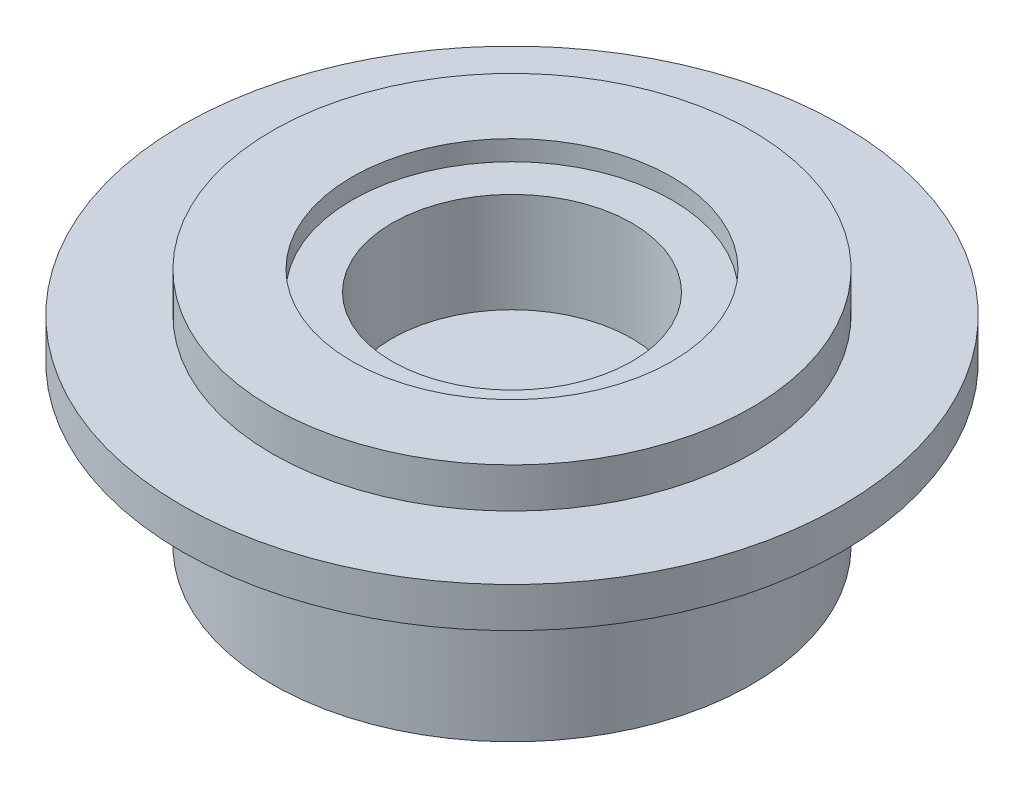
ISO-10303-21;
HEADER;
FILE_DESCRIPTION(('STEP AP214'),'2;1');
FILE_NAME('part.step','',(''),(''),'','','');
FILE_SCHEMA(('AUTOMOTIVE_DESIGN { 1 0 10303 214 1 1 1 1 }'));
ENDSEC;
DATA;
#1=APPLICATION_CONTEXT('core data for automotive mechanical design processes');
#2=APPLICATION_PROTOCOL_DEFINITION('international standard','automotive_design',2000,#1);
#3=PRODUCT_CONTEXT('',#1,'mechanical');
#4=PRODUCT('Part','Part','',(#3));
#5=PRODUCT_RELATED_PRODUCT_CATEGORY('part','',(#4));
#6=PRODUCT_DEFINITION_FORMATION('','',#4);
#7=PRODUCT_DEFINITION_CONTEXT('part definition',#1,'design');
#8=PRODUCT_DEFINITION('design','',#6,#7);
#9=PRODUCT_DEFINITION_SHAPE('','',#8);
#10=(LENGTH_UNIT() NAMED_UNIT(*) SI_UNIT(.MILLI.,.METRE.));
#11=(NAMED_UNIT(*) PLANE_ANGLE_UNIT() SI_UNIT($,.RADIAN.));
#12=(NAMED_UNIT(*) SI_UNIT($,.STERADIAN.) SOLID_ANGLE_UNIT());
#13=UNCERTAINTY_MEASURE_WITH_UNIT(LENGTH_MEASURE(1.E-05),#10,'distance_accuracy_value','');
#14=(GEOMETRIC_REPRESENTATION_CONTEXT(3) GLOBAL_UNCERTAINTY_ASSIGNED_CONTEXT((#13)) GLOBAL_UNIT_ASSIGNED_CONTEXT((#10,
#11,#12)) REPRESENTATION_CONTEXT('',''));
#15=CARTESIAN_POINT('',(0.,0.,0.));
#16=DIRECTION('',(0.,0.,1.));
#17=DIRECTION('',(1.,0.,0.));
#18=AXIS2_PLACEMENT_3D('',#15,#16,#17);
#19=CARTESIAN_POINT('',(0.,1.,0.));
#20=DIRECTION('',(0.,-1.,0.));
#21=DIRECTION('',(0.,0.,-1.));
#22=AXIS2_PLACEMENT_3D('',#19,#20,#21);
#23=CYLINDRICAL_SURFACE('',#22,16.5);
#24=CARTESIAN_POINT('',(0.,1.,0.));
#25=DIRECTION('',(0.,1.,0.));
#26=DIRECTION('',(0.,0.,1.));
#27=AXIS2_PLACEMENT_3D('',#24,#25,#26);
#28=CIRCLE('',#27,16.5);
#29=CARTESIAN_POINT('',(0.,1.,16.5));
#30=VERTEX_POINT('',#29);
#31=EDGE_CURVE('E42',#30,#30,#28,.T.);
#32=ORIENTED_EDGE('',*,*,#31,.F.);
#33=EDGE_LOOP('',(#32));
#34=FACE_BOUND('',#33,.T.);
#35=CARTESIAN_POINT('',(0.,-1.,0.));
#36=DIRECTION('',(0.,1.,0.));
#37=DIRECTION('',(0.,0.,1.));
#38=AXIS2_PLACEMENT_3D('',#35,#36,#37);
#39=CIRCLE('',#38,16.5);
#40=CARTESIAN_POINT('',(0.,-1.,16.5));
#41=VERTEX_POINT('',#40);
#42=EDGE_CURVE('E50',#41,#41,#39,.T.);
#43=ORIENTED_EDGE('',*,*,#42,.T.);
#44=EDGE_LOOP('',(#43));
#45=FACE_BOUND('',#44,.T.);
#46=ADVANCED_FACE('F30',(#34,#45),#23,.T.);
#47=CARTESIAN_POINT('',(0.,1.,0.));
#48=DIRECTION('',(0.,1.,0.));
#49=DIRECTION('',(0.,0.,1.));
#50=AXIS2_PLACEMENT_3D('',#47,#48,#49);
#51=PLANE('',#50);
#52=CARTESIAN_POINT('',(0.,1.,0.));
#53=DIRECTION('',(0.,1.,0.));
#54=DIRECTION('',(0.,0.,1.));
#55=AXIS2_PLACEMENT_3D('',#52,#53,#54);
#56=CIRCLE('',#55,12.);
#57=CARTESIAN_POINT('',(0.,1.,12.));
#58=VERTEX_POINT('',#57);
#59=EDGE_CURVE('E10',#58,#58,#56,.T.);
#60=ORIENTED_EDGE('',*,*,#59,.F.);
#61=EDGE_LOOP('',(#60));
#62=FACE_BOUND('',#61,.T.);
#63=ORIENTED_EDGE('',*,*,#31,.T.);
#64=EDGE_LOOP('',(#63));
#65=FACE_BOUND('',#64,.T.);
#66=ADVANCED_FACE('F60',(#62,#65),#51,.T.);
#67=CARTESIAN_POINT('',(0.,-1.,0.));
#68=DIRECTION('',(0.,1.,0.));
#69=DIRECTION('',(0.,0.,1.));
#70=AXIS2_PLACEMENT_3D('',#67,#68,#69);
#71=PLANE('',#70);
#72=CARTESIAN_POINT('',(0.,-1.,0.));
#73=DIRECTION('',(0.,-1.,0.));
#74=DIRECTION('',(0.,0.,-1.));
#75=AXIS2_PLACEMENT_3D('',#72,#73,#74);
#76=CIRCLE('',#75,12.);
#77=CARTESIAN_POINT('',(0.,-1.,-12.));
#78=VERTEX_POINT('',#77);
#79=EDGE_CURVE('E37',#78,#78,#76,.T.);
#80=ORIENTED_EDGE('',*,*,#79,.F.);
#81=EDGE_LOOP('',(#80));
#82=FACE_BOUND('',#81,.T.);
#83=ORIENTED_EDGE('',*,*,#42,.F.);
#84=EDGE_LOOP('',(#83));
#85=FACE_BOUND('',#84,.T.);
#86=ADVANCED_FACE('F57',(#82,#85),#71,.F.);
#87=CARTESIAN_POINT('',(0.,-9.,0.));
#88=DIRECTION('',(0.,1.,0.));
#89=DIRECTION('',(0.,0.,1.));
#90=AXIS2_PLACEMENT_3D('',#87,#88,#89);
#91=CYLINDRICAL_SURFACE('',#90,12.);
#92=CARTESIAN_POINT('',(0.,-9.,0.));
#93=DIRECTION('',(0.,-1.,0.));
#94=DIRECTION('',(0.,0.,-1.));
#95=AXIS2_PLACEMENT_3D('',#92,#93,#94);
#96=CIRCLE('',#95,12.);
#97=CARTESIAN_POINT('',(0.,-9.,-12.));
#98=VERTEX_POINT('',#97);
#99=EDGE_CURVE('E48',#98,#98,#96,.T.);
#100=ORIENTED_EDGE('',*,*,#99,.F.);
#101=EDGE_LOOP('',(#100));
#102=FACE_BOUND('',#101,.T.);
#103=ORIENTED_EDGE('',*,*,#79,.T.);
#104=EDGE_LOOP('',(#103));
#105=FACE_BOUND('',#104,.T.);
#106=ADVANCED_FACE('F59',(#102,#105),#91,.T.);
#107=CARTESIAN_POINT('',(0.,-9.,0.));
#108=DIRECTION('',(0.,-1.,0.));
#109=DIRECTION('',(0.,0.,-1.));
#110=AXIS2_PLACEMENT_3D('',#107,#108,#109);
#111=PLANE('',#110);
#112=ORIENTED_EDGE('',*,*,#99,.T.);
#113=EDGE_LOOP('',(#112));
#114=FACE_BOUND('',#113,.T.);
#115=ADVANCED_FACE('F66',(#114),#111,.T.);
#116=CARTESIAN_POINT('',(0.,3.,0.));
#117=DIRECTION('',(0.,-1.,0.));
#118=DIRECTION('',(0.,0.,-1.));
#119=AXIS2_PLACEMENT_3D('',#116,#117,#118);
#120=CYLINDRICAL_SURFACE('',#119,12.);
#121=CARTESIAN_POINT('',(0.,3.,0.));
#122=DIRECTION('',(0.,1.,0.));
#123=DIRECTION('',(0.,0.,1.));
#124=AXIS2_PLACEMENT_3D('',#121,#122,#123);
#125=CIRCLE('',#124,12.);
#126=CARTESIAN_POINT('',(0.,3.,12.));
#127=VERTEX_POINT('',#126);
#128=EDGE_CURVE('E46',#127,#127,#125,.T.);
#129=ORIENTED_EDGE('',*,*,#128,.F.);
#130=EDGE_LOOP('',(#129));
#131=FACE_BOUND('',#130,.T.);
#132=ORIENTED_EDGE('',*,*,#59,.T.);
#133=EDGE_LOOP('',(#132));
#134=FACE_BOUND('',#133,.T.);
#135=ADVANCED_FACE('F93',(#131,#134),#120,.T.);
#136=CARTESIAN_POINT('',(0.,3.,0.));
#137=DIRECTION('',(0.,1.,0.));
#138=DIRECTION('',(0.,0.,1.));
#139=AXIS2_PLACEMENT_3D('',#136,#137,#138);
#140=PLANE('',#139);
#141=CARTESIAN_POINT('',(0.,3.,0.));
#142=DIRECTION('',(0.,1.,0.));
#143=DIRECTION('',(0.,0.,1.));
#144=AXIS2_PLACEMENT_3D('',#141,#142,#143);
#145=CIRCLE('',#144,8.);
#146=CARTESIAN_POINT('',(0.,3.,8.));
#147=VERTEX_POINT('',#146);
#148=EDGE_CURVE('E176',#147,#147,#145,.T.);
#149=ORIENTED_EDGE('',*,*,#148,.F.);
#150=EDGE_LOOP('',(#149));
#151=FACE_BOUND('',#150,.T.);
#152=ORIENTED_EDGE('',*,*,#128,.T.);
#153=EDGE_LOOP('',(#152));
#154=FACE_BOUND('',#153,.T.);
#155=ADVANCED_FACE('F98',(#151,#154),#140,.T.);
#156=CARTESIAN_POINT('',(0.,2.,0.));
#157=DIRECTION('',(0.,1.,0.));
#158=DIRECTION('',(0.,0.,1.));
#159=AXIS2_PLACEMENT_3D('',#156,#157,#158);
#160=PLANE('',#159);
#161=CARTESIAN_POINT('',(0.,2.,0.));
#162=DIRECTION('',(0.,1.,0.));
#163=DIRECTION('',(0.,0.,1.));
#164=AXIS2_PLACEMENT_3D('',#161,#162,#163);
#165=CIRCLE('',#164,8.);
#166=CARTESIAN_POINT('',(0.,2.,8.));
#167=VERTEX_POINT('',#166);
#168=EDGE_CURVE('E174',#167,#167,#165,.T.);
#169=ORIENTED_EDGE('',*,*,#168,.T.);
#170=EDGE_LOOP('',(#169));
#171=FACE_BOUND('',#170,.T.);
#172=CARTESIAN_POINT('',(0.,2.,0.));
#173=DIRECTION('',(0.,1.,0.));
#174=DIRECTION('',(0.,0.,1.));
#175=AXIS2_PLACEMENT_3D('',#172,#173,#174);
#176=CIRCLE('',#175,6.);
#177=CARTESIAN_POINT('',(0.,2.,6.));
#178=VERTEX_POINT('',#177);
#179=EDGE_CURVE('E33',#178,#178,#176,.F.);
#180=ORIENTED_EDGE('',*,*,#179,.T.);
#181=EDGE_LOOP('',(#180));
#182=FACE_BOUND('',#181,.T.);
#183=ADVANCED_FACE('F123',(#171,#182),#160,.T.);
#184=CARTESIAN_POINT('',(0.,2.,0.));
#185=DIRECTION('',(0.,1.,0.));
#186=DIRECTION('',(0.,0.,1.));
#187=AXIS2_PLACEMENT_3D('',#184,#185,#186);
#188=CYLINDRICAL_SURFACE('',#187,8.);
#189=ORIENTED_EDGE('',*,*,#168,.F.);
#190=EDGE_LOOP('',(#189));
#191=FACE_BOUND('',#190,.T.);
#192=ORIENTED_EDGE('',*,*,#148,.T.);
#193=EDGE_LOOP('',(#192));
#194=FACE_BOUND('',#193,.T.);
#195=ADVANCED_FACE('F112',(#191,#194),#188,.F.);
#196=CARTESIAN_POINT('',(0.,-3.,0.));
#197=DIRECTION('',(0.,1.,0.));
#198=DIRECTION('',(0.,0.,1.));
#199=AXIS2_PLACEMENT_3D('',#196,#197,#198);
#200=PLANE('',#199);
#201=CARTESIAN_POINT('',(0.,-3.,0.));
#202=DIRECTION('',(0.,1.,0.));
#203=DIRECTION('',(0.,0.,1.));
#204=AXIS2_PLACEMENT_3D('',#201,#202,#203);
#205=CIRCLE('',#204,6.);
#206=CARTESIAN_POINT('',(0.,-3.,6.));
#207=VERTEX_POINT('',#206);
#208=EDGE_CURVE('E170',#207,#207,#205,.T.);
#209=ORIENTED_EDGE('',*,*,#208,.T.);
#210=EDGE_LOOP('',(#209));
#211=FACE_BOUND('',#210,.T.);
#212=ADVANCED_FACE('F106',(#211),#200,.T.);
#213=CARTESIAN_POINT('',(0.,-3.,0.));
#214=DIRECTION('',(0.,1.,0.));
#215=DIRECTION('',(0.,0.,1.));
#216=AXIS2_PLACEMENT_3D('',#213,#214,#215);
#217=CYLINDRICAL_SURFACE('',#216,6.);
#218=ORIENTED_EDGE('',*,*,#208,.F.);
#219=EDGE_LOOP('',(#218));
#220=FACE_BOUND('',#219,.T.);
#221=ORIENTED_EDGE('',*,*,#179,.F.);
#222=EDGE_LOOP('',(#221));
#223=FACE_BOUND('',#222,.T.);
#224=ADVANCED_FACE('F111',(#220,#223),#217,.F.);
#225=CLOSED_SHELL('',(#46,#66,#86,#106,#115,#135,#155,#183,#195,#212,#224));
#226=MANIFOLD_SOLID_BREP('B2',#225);
#227=ADVANCED_BREP_SHAPE_REPRESENTATION('',(#18,#226),#14);
#228=SHAPE_DEFINITION_REPRESENTATION(#9,#227);
ENDSEC;
END-ISO-10303-21;
